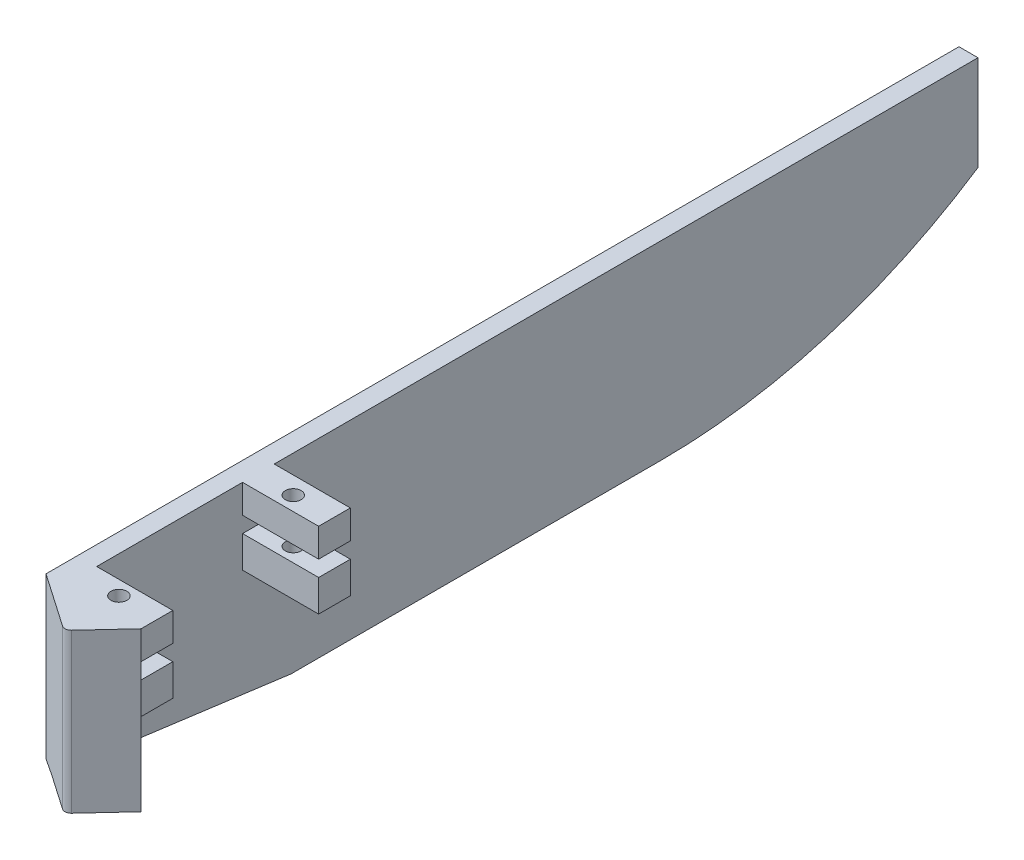
ISO-10303-21;
HEADER;
FILE_DESCRIPTION(('STEP AP214'),'2;1');
FILE_NAME('part.step','',(''),(''),'','','');
FILE_SCHEMA(('AUTOMOTIVE_DESIGN { 1 0 10303 214 1 1 1 1 }'));
ENDSEC;
DATA;
#1=APPLICATION_CONTEXT('core data for automotive mechanical design processes');
#2=APPLICATION_PROTOCOL_DEFINITION('international standard','automotive_design',2000,#1);
#3=PRODUCT_CONTEXT('',#1,'mechanical');
#4=PRODUCT('Part','Part','',(#3));
#5=PRODUCT_RELATED_PRODUCT_CATEGORY('part','',(#4));
#6=PRODUCT_DEFINITION_FORMATION('','',#4);
#7=PRODUCT_DEFINITION_CONTEXT('part definition',#1,'design');
#8=PRODUCT_DEFINITION('design','',#6,#7);
#9=PRODUCT_DEFINITION_SHAPE('','',#8);
#10=(LENGTH_UNIT() NAMED_UNIT(*) SI_UNIT(.MILLI.,.METRE.));
#11=(NAMED_UNIT(*) PLANE_ANGLE_UNIT() SI_UNIT($,.RADIAN.));
#12=(NAMED_UNIT(*) SI_UNIT($,.STERADIAN.) SOLID_ANGLE_UNIT());
#13=UNCERTAINTY_MEASURE_WITH_UNIT(LENGTH_MEASURE(1.E-05),#10,'distance_accuracy_value','');
#14=(GEOMETRIC_REPRESENTATION_CONTEXT(3) GLOBAL_UNCERTAINTY_ASSIGNED_CONTEXT((#13)) GLOBAL_UNIT_ASSIGNED_CONTEXT((#10,
#11,#12)) REPRESENTATION_CONTEXT('',''));
#15=CARTESIAN_POINT('',(0.,0.,0.));
#16=DIRECTION('',(0.,0.,1.));
#17=DIRECTION('',(1.,0.,0.));
#18=AXIS2_PLACEMENT_3D('',#15,#16,#17);
#19=CARTESIAN_POINT('',(3.,0.,0.));
#20=DIRECTION('',(0.,1.,0.));
#21=DIRECTION('',(0.,0.,1.));
#22=AXIS2_PLACEMENT_3D('',#19,#20,#21);
#23=PLANE('',#22);
#24=DIRECTION('',(1.,0.,0.));
#25=VECTOR('',#24,1.);
#26=CARTESIAN_POINT('',(-11.,0.,-100.));
#27=LINE('',#26,#25);
#28=CARTESIAN_POINT('',(0.,0.,-100.));
#29=VERTEX_POINT('',#28);
#30=CARTESIAN_POINT('',(3.,0.,-100.));
#31=VERTEX_POINT('',#30);
#32=EDGE_CURVE('E199',#29,#31,#27,.T.);
#33=ORIENTED_EDGE('',*,*,#32,.T.);
#34=DIRECTION('',(0.,0.,-1.));
#35=VECTOR('',#34,1.);
#36=CARTESIAN_POINT('',(3.,0.,0.));
#37=LINE('',#36,#35);
#38=CARTESIAN_POINT('',(3.,0.,-41.6596314448645));
#39=VERTEX_POINT('',#38);
#40=EDGE_CURVE('E208',#39,#31,#37,.T.);
#41=ORIENTED_EDGE('',*,*,#40,.F.);
#42=DIRECTION('',(1.,0.,0.));
#43=VECTOR('',#42,1.);
#44=CARTESIAN_POINT('',(-11.,0.,-41.6596314448645));
#45=LINE('',#44,#43);
#46=CARTESIAN_POINT('',(0.,0.,-41.6596314448645));
#47=VERTEX_POINT('',#46);
#48=EDGE_CURVE('E264',#47,#39,#45,.T.);
#49=ORIENTED_EDGE('',*,*,#48,.F.);
#50=DIRECTION('',(0.,0.,-1.));
#51=VECTOR('',#50,1.);
#52=CARTESIAN_POINT('',(0.,0.,0.));
#53=LINE('',#52,#51);
#54=EDGE_CURVE('E210',#47,#29,#53,.T.);
#55=ORIENTED_EDGE('',*,*,#54,.T.);
#56=EDGE_LOOP('',(#33,#41,#49,#55));
#57=FACE_BOUND('',#56,.T.);
#58=ADVANCED_FACE('F36',(#57),#23,.F.);
#59=CARTESIAN_POINT('',(3.,30.,0.));
#60=DIRECTION('',(0.,-1.,0.));
#61=DIRECTION('',(0.,0.,-1.));
#62=AXIS2_PLACEMENT_3D('',#59,#60,#61);
#63=PLANE('',#62);
#64=CARTESIAN_POINT('',(8.75,30.,-36.25));
#65=DIRECTION('',(0.,1.,0.));
#66=DIRECTION('',(0.,0.,1.));
#67=AXIS2_PLACEMENT_3D('',#64,#65,#66);
#68=CIRCLE('',#67,1.25);
#69=CARTESIAN_POINT('',(8.75,30.,-35.));
#70=VERTEX_POINT('',#69);
#71=EDGE_CURVE('E420',#70,#70,#68,.T.);
#72=ORIENTED_EDGE('',*,*,#71,.F.);
#73=EDGE_LOOP('',(#72));
#74=FACE_BOUND('',#73,.T.);
#75=CARTESIAN_POINT('',(8.75,30.,-8.75));
#76=DIRECTION('',(0.,1.,0.));
#77=DIRECTION('',(0.,0.,1.));
#78=AXIS2_PLACEMENT_3D('',#75,#76,#77);
#79=CIRCLE('',#78,1.25);
#80=CARTESIAN_POINT('',(8.75,30.,-7.5));
#81=VERTEX_POINT('',#80);
#82=EDGE_CURVE('E417',#81,#81,#79,.T.);
#83=ORIENTED_EDGE('',*,*,#82,.F.);
#84=EDGE_LOOP('',(#83));
#85=FACE_BOUND('',#84,.T.);
#86=CARTESIAN_POINT('',(9.,30.,-1.));
#87=DIRECTION('',(0.,1.,0.));
#88=DIRECTION('',(0.,0.,1.));
#89=AXIS2_PLACEMENT_3D('',#86,#87,#88);
#90=CIRCLE('',#89,1.);
#91=CARTESIAN_POINT('',(9.73327595839466,30.,-0.320068849926411));
#92=VERTEX_POINT('',#91);
#93=CARTESIAN_POINT('',(8.43174760537926,30.,-0.177145689682673));
#94=VERTEX_POINT('',#93);
#95=EDGE_CURVE('E274',#92,#94,#90,.F.);
#96=ORIENTED_EDGE('',*,*,#95,.F.);
#97=DIRECTION('',(-0.679931150073591,0.,0.733275958394658));
#98=VECTOR('',#97,1.);
#99=CARTESIAN_POINT('',(5.0739414731185,30.,4.70481927264654));
#100=LINE('',#99,#98);
#101=CARTESIAN_POINT('',(15.,30.,-6.));
#102=VERTEX_POINT('',#101);
#103=EDGE_CURVE('E410',#102,#92,#100,.T.);
#104=ORIENTED_EDGE('',*,*,#103,.F.);
#105=DIRECTION('',(0.,0.,1.));
#106=VECTOR('',#105,1.);
#107=CARTESIAN_POINT('',(15.,30.,-6.));
#108=LINE('',#107,#106);
#109=CARTESIAN_POINT('',(15.,30.,-11.));
#110=VERTEX_POINT('',#109);
#111=EDGE_CURVE('E313',#110,#102,#108,.T.);
#112=ORIENTED_EDGE('',*,*,#111,.F.);
#113=DIRECTION('',(-1.,0.,0.));
#114=VECTOR('',#113,1.);
#115=CARTESIAN_POINT('',(15.,30.,-11.));
#116=LINE('',#115,#114);
#117=CARTESIAN_POINT('',(3.,30.,-11.));
#118=VERTEX_POINT('',#117);
#119=EDGE_CURVE('E226',#110,#118,#116,.T.);
#120=ORIENTED_EDGE('',*,*,#119,.T.);
#121=DIRECTION('',(0.,0.,1.));
#122=VECTOR('',#121,1.);
#123=CARTESIAN_POINT('',(3.,30.,0.));
#124=LINE('',#123,#122);
#125=CARTESIAN_POINT('',(3.,30.,-34.));
#126=VERTEX_POINT('',#125);
#127=EDGE_CURVE('E220',#126,#118,#124,.T.);
#128=ORIENTED_EDGE('',*,*,#127,.F.);
#129=DIRECTION('',(-1.,0.,0.));
#130=VECTOR('',#129,1.);
#131=CARTESIAN_POINT('',(15.,30.,-34.));
#132=LINE('',#131,#130);
#133=CARTESIAN_POINT('',(15.,30.,-34.));
#134=VERTEX_POINT('',#133);
#135=EDGE_CURVE('E300',#134,#126,#132,.T.);
#136=ORIENTED_EDGE('',*,*,#135,.F.);
#137=DIRECTION('',(0.,0.,1.));
#138=VECTOR('',#137,1.);
#139=CARTESIAN_POINT('',(15.,30.,-34.));
#140=LINE('',#139,#138);
#141=CARTESIAN_POINT('',(15.,30.,-39.));
#142=VERTEX_POINT('',#141);
#143=EDGE_CURVE('E299',#142,#134,#140,.T.);
#144=ORIENTED_EDGE('',*,*,#143,.F.);
#145=DIRECTION('',(-1.,0.,0.));
#146=VECTOR('',#145,1.);
#147=CARTESIAN_POINT('',(15.,30.,-39.));
#148=LINE('',#147,#146);
#149=CARTESIAN_POINT('',(3.,30.,-39.));
#150=VERTEX_POINT('',#149);
#151=EDGE_CURVE('E291',#142,#150,#148,.T.);
#152=ORIENTED_EDGE('',*,*,#151,.T.);
#153=CARTESIAN_POINT('',(3.,30.,-150.));
#154=VERTEX_POINT('',#153);
#155=EDGE_CURVE('E229',#154,#150,#124,.T.);
#156=ORIENTED_EDGE('',*,*,#155,.F.);
#157=DIRECTION('',(-1.,0.,0.));
#158=VECTOR('',#157,1.);
#159=CARTESIAN_POINT('',(3.,30.,-150.));
#160=LINE('',#159,#158);
#161=CARTESIAN_POINT('',(0.,30.,-150.));
#162=VERTEX_POINT('',#161);
#163=EDGE_CURVE('E231',#154,#162,#160,.T.);
#164=ORIENTED_EDGE('',*,*,#163,.T.);
#165=DIRECTION('',(0.,0.,1.));
#166=VECTOR('',#165,1.);
#167=CARTESIAN_POINT('',(0.,30.,0.));
#168=LINE('',#167,#166);
#169=CARTESIAN_POINT('',(0.,30.,-6.));
#170=VERTEX_POINT('',#169);
#171=EDGE_CURVE('E218',#162,#170,#168,.T.);
#172=ORIENTED_EDGE('',*,*,#171,.T.);
#173=DIRECTION('',(0.822854310317324,0.,0.568252394620736));
#174=VECTOR('',#173,1.);
#175=CARTESIAN_POINT('',(2.80553359357088,30.,-4.0625352960468));
#176=LINE('',#175,#174);
#177=EDGE_CURVE('E268',#170,#94,#176,.T.);
#178=ORIENTED_EDGE('',*,*,#177,.T.);
#179=EDGE_LOOP('',(#96,#104,#112,#120,#128,#136,#144,#152,#156,#164,#172,#178));
#180=FACE_BOUND('',#179,.T.);
#181=ADVANCED_FACE('F276',(#74,#85,#180),#63,.F.);
#182=CARTESIAN_POINT('',(0.,0.,0.));
#183=DIRECTION('',(-1.,0.,0.));
#184=DIRECTION('',(0.,0.,1.));
#185=AXIS2_PLACEMENT_3D('',#182,#183,#184);
#186=PLANE('',#185);
#187=CARTESIAN_POINT('',(0.,90.8333333333334,-100.));
#188=DIRECTION('',(-1.,0.,0.));
#189=DIRECTION('',(0.,0.,1.));
#190=AXIS2_PLACEMENT_3D('',#187,#188,#189);
#191=CIRCLE('',#190,90.8333333333334);
#192=CARTESIAN_POINT('',(0.,15.,-150.));
#193=VERTEX_POINT('',#192);
#194=EDGE_CURVE('E50',#29,#193,#191,.F.);
#195=ORIENTED_EDGE('',*,*,#194,.F.);
#196=ORIENTED_EDGE('',*,*,#54,.F.);
#197=DIRECTION('',(0.,-0.131367240534839,-0.991333772305908));
#198=VECTOR('',#197,1.);
#199=CARTESIAN_POINT('',(0.,5.42528306650027,-0.718934919274195));
#200=LINE('',#199,#198);
#201=CARTESIAN_POINT('',(0.,4.72545928754627,-6.));
#202=VERTEX_POINT('',#201);
#203=EDGE_CURVE('E254',#202,#47,#200,.T.);
#204=ORIENTED_EDGE('',*,*,#203,.F.);
#205=DIRECTION('',(0.,1.,0.));
#206=VECTOR('',#205,1.);
#207=CARTESIAN_POINT('',(0.,0.,-6.));
#208=LINE('',#207,#206);
#209=EDGE_CURVE('E236',#202,#170,#208,.T.);
#210=ORIENTED_EDGE('',*,*,#209,.T.);
#211=ORIENTED_EDGE('',*,*,#171,.F.);
#212=DIRECTION('',(0.,1.,0.));
#213=VECTOR('',#212,1.);
#214=CARTESIAN_POINT('',(0.,0.,-150.));
#215=LINE('',#214,#213);
#216=EDGE_CURVE('E223',#193,#162,#215,.T.);
#217=ORIENTED_EDGE('',*,*,#216,.F.);
#218=EDGE_LOOP('',(#195,#196,#204,#210,#211,#217));
#219=FACE_BOUND('',#218,.T.);
#220=ADVANCED_FACE('F260',(#219),#186,.T.);
#221=CARTESIAN_POINT('',(3.,0.,0.));
#222=DIRECTION('',(-1.,0.,0.));
#223=DIRECTION('',(0.,0.,1.));
#224=AXIS2_PLACEMENT_3D('',#221,#222,#223);
#225=PLANE('',#224);
#226=ORIENTED_EDGE('',*,*,#40,.T.);
#227=CARTESIAN_POINT('',(3.,90.8333333333334,-100.));
#228=DIRECTION('',(-1.,0.,0.));
#229=DIRECTION('',(0.,0.,1.));
#230=AXIS2_PLACEMENT_3D('',#227,#228,#229);
#231=CIRCLE('',#230,90.8333333333334);
#232=CARTESIAN_POINT('',(3.,15.,-150.));
#233=VERTEX_POINT('',#232);
#234=EDGE_CURVE('E196',#233,#31,#231,.T.);
#235=ORIENTED_EDGE('',*,*,#234,.F.);
#236=DIRECTION('',(0.,1.,0.));
#237=VECTOR('',#236,1.);
#238=CARTESIAN_POINT('',(3.,0.,-150.));
#239=LINE('',#238,#237);
#240=EDGE_CURVE('E217',#233,#154,#239,.T.);
#241=ORIENTED_EDGE('',*,*,#240,.T.);
#242=ORIENTED_EDGE('',*,*,#155,.T.);
#243=DIRECTION('',(0.,1.,0.));
#244=VECTOR('',#243,1.);
#245=CARTESIAN_POINT('',(3.,30.,-39.));
#246=LINE('',#245,#244);
#247=CARTESIAN_POINT('',(3.,25.5,-39.));
#248=VERTEX_POINT('',#247);
#249=EDGE_CURVE('E283',#248,#150,#246,.T.);
#250=ORIENTED_EDGE('',*,*,#249,.F.);
#251=DIRECTION('',(0.,0.,-1.));
#252=VECTOR('',#251,1.);
#253=CARTESIAN_POINT('',(3.,25.5,-34.));
#254=LINE('',#253,#252);
#255=CARTESIAN_POINT('',(3.,25.5,-34.));
#256=VERTEX_POINT('',#255);
#257=EDGE_CURVE('E296',#256,#248,#254,.T.);
#258=ORIENTED_EDGE('',*,*,#257,.F.);
#259=DIRECTION('',(0.,-1.,0.));
#260=VECTOR('',#259,1.);
#261=CARTESIAN_POINT('',(3.,30.,-34.));
#262=LINE('',#261,#260);
#263=EDGE_CURVE('E465',#126,#256,#262,.T.);
#264=ORIENTED_EDGE('',*,*,#263,.F.);
#265=ORIENTED_EDGE('',*,*,#127,.T.);
#266=DIRECTION('',(0.,1.,0.));
#267=VECTOR('',#266,1.);
#268=CARTESIAN_POINT('',(3.,30.,-11.));
#269=LINE('',#268,#267);
#270=CARTESIAN_POINT('',(3.,25.500001474005,-11.));
#271=VERTEX_POINT('',#270);
#272=EDGE_CURVE('E309',#271,#118,#269,.T.);
#273=ORIENTED_EDGE('',*,*,#272,.F.);
#274=DIRECTION('',(0.,0.,-1.));
#275=VECTOR('',#274,1.);
#276=CARTESIAN_POINT('',(3.,25.500001474005,-6.00364225789055));
#277=LINE('',#276,#275);
#278=CARTESIAN_POINT('',(3.,25.500001474005,-6.00364225789055));
#279=VERTEX_POINT('',#278);
#280=EDGE_CURVE('E314',#279,#271,#277,.T.);
#281=ORIENTED_EDGE('',*,*,#280,.F.);
#282=DIRECTION('',(0.,1.,0.));
#283=VECTOR('',#282,1.);
#284=CARTESIAN_POINT('',(3.,25.500001474005,-6.00364225789055));
#285=LINE('',#284,#283);
#286=CARTESIAN_POINT('',(3.,23.000001474005,-6.00364225789055));
#287=VERTEX_POINT('',#286);
#288=EDGE_CURVE('E343',#287,#279,#285,.T.);
#289=ORIENTED_EDGE('',*,*,#288,.F.);
#290=DIRECTION('',(0.,0.,1.));
#291=VECTOR('',#290,1.);
#292=CARTESIAN_POINT('',(3.,23.000001474005,-6.00364225789055));
#293=LINE('',#292,#291);
#294=CARTESIAN_POINT('',(3.,23.000001474005,-11.0036422578905));
#295=VERTEX_POINT('',#294);
#296=EDGE_CURVE('E340',#295,#287,#293,.T.);
#297=ORIENTED_EDGE('',*,*,#296,.F.);
#298=DIRECTION('',(0.,1.,0.));
#299=VECTOR('',#298,1.);
#300=CARTESIAN_POINT('',(3.,23.000001474005,-11.0036422578905));
#301=LINE('',#300,#299);
#302=CARTESIAN_POINT('',(3.,18.000001474005,-11.0036422578906));
#303=VERTEX_POINT('',#302);
#304=EDGE_CURVE('E337',#303,#295,#301,.T.);
#305=ORIENTED_EDGE('',*,*,#304,.F.);
#306=DIRECTION('',(0.,0.,-1.));
#307=VECTOR('',#306,1.);
#308=CARTESIAN_POINT('',(3.,18.000001474005,-6.00364225789055));
#309=LINE('',#308,#307);
#310=CARTESIAN_POINT('',(3.,18.000001474005,-6.00364225789055));
#311=VERTEX_POINT('',#310);
#312=EDGE_CURVE('E334',#311,#303,#309,.T.);
#313=ORIENTED_EDGE('',*,*,#312,.F.);
#314=DIRECTION('',(0.,1.,0.));
#315=VECTOR('',#314,1.);
#316=CARTESIAN_POINT('',(3.,18.000001474005,-6.00364225789055));
#317=LINE('',#316,#315);
#318=CARTESIAN_POINT('',(3.,5.,-6.00364225789055));
#319=VERTEX_POINT('',#318);
#320=EDGE_CURVE('E332',#319,#311,#317,.T.);
#321=ORIENTED_EDGE('',*,*,#320,.F.);
#322=DIRECTION('',(0.,0.,-1.));
#323=VECTOR('',#322,1.);
#324=CARTESIAN_POINT('',(3.,5.,7.99635774210946));
#325=LINE('',#324,#323);
#326=CARTESIAN_POINT('',(3.,5.,-3.92823934627651));
#327=VERTEX_POINT('',#326);
#328=EDGE_CURVE('E400',#327,#319,#325,.T.);
#329=ORIENTED_EDGE('',*,*,#328,.F.);
#330=DIRECTION('',(0.,0.131367240534839,0.991333772305908));
#331=VECTOR('',#330,1.);
#332=CARTESIAN_POINT('',(3.,5.,-3.92823934627651));
#333=LINE('',#332,#331);
#334=EDGE_CURVE('E216',#39,#327,#333,.T.);
#335=ORIENTED_EDGE('',*,*,#334,.F.);
#336=EDGE_LOOP('',(#226,#235,#241,#242,#250,#258,#264,#265,#273,#281,#289,#297,#305,#313,#321,
#329,#335));
#337=FACE_BOUND('',#336,.T.);
#338=DIRECTION('',(0.,-1.,0.));
#339=VECTOR('',#338,1.);
#340=CARTESIAN_POINT('',(3.,23.000001474005,-34.0036422578905));
#341=LINE('',#340,#339);
#342=CARTESIAN_POINT('',(3.,23.000001474005,-34.0036422578905));
#343=VERTEX_POINT('',#342);
#344=CARTESIAN_POINT('',(3.,18.000001474005,-34.0036422578905));
#345=VERTEX_POINT('',#344);
#346=EDGE_CURVE('E432',#343,#345,#341,.T.);
#347=ORIENTED_EDGE('',*,*,#346,.F.);
#348=DIRECTION('',(0.,0.,1.));
#349=VECTOR('',#348,1.);
#350=CARTESIAN_POINT('',(3.,23.000001474005,-34.0036422578905));
#351=LINE('',#350,#349);
#352=CARTESIAN_POINT('',(3.,23.000001474005,-39.0036422578905));
#353=VERTEX_POINT('',#352);
#354=EDGE_CURVE('E437',#353,#343,#351,.T.);
#355=ORIENTED_EDGE('',*,*,#354,.F.);
#356=DIRECTION('',(0.,1.,0.));
#357=VECTOR('',#356,1.);
#358=CARTESIAN_POINT('',(3.,23.000001474005,-39.0036422578905));
#359=LINE('',#358,#357);
#360=CARTESIAN_POINT('',(3.,18.000001474005,-39.0036422578905));
#361=VERTEX_POINT('',#360);
#362=EDGE_CURVE('E449',#361,#353,#359,.T.);
#363=ORIENTED_EDGE('',*,*,#362,.F.);
#364=DIRECTION('',(0.,0.,-1.));
#365=VECTOR('',#364,1.);
#366=CARTESIAN_POINT('',(3.,18.000001474005,-34.0036422578905));
#367=LINE('',#366,#365);
#368=EDGE_CURVE('E446',#345,#361,#367,.T.);
#369=ORIENTED_EDGE('',*,*,#368,.F.);
#370=EDGE_LOOP('',(#347,#355,#363,#369));
#371=FACE_BOUND('',#370,.T.);
#372=ADVANCED_FACE('F213',(#337,#371),#225,.F.);
#373=CARTESIAN_POINT('',(3.,0.,-150.));
#374=DIRECTION('',(0.,0.,1.));
#375=DIRECTION('',(1.,0.,0.));
#376=AXIS2_PLACEMENT_3D('',#373,#374,#375);
#377=PLANE('',#376);
#378=ORIENTED_EDGE('',*,*,#240,.F.);
#379=DIRECTION('',(1.,0.,0.));
#380=VECTOR('',#379,1.);
#381=CARTESIAN_POINT('',(-11.,15.,-150.));
#382=LINE('',#381,#380);
#383=EDGE_CURVE('E12',#233,#193,#382,.F.);
#384=ORIENTED_EDGE('',*,*,#383,.T.);
#385=ORIENTED_EDGE('',*,*,#216,.T.);
#386=ORIENTED_EDGE('',*,*,#163,.F.);
#387=EDGE_LOOP('',(#378,#384,#385,#386));
#388=FACE_BOUND('',#387,.T.);
#389=ADVANCED_FACE('F281',(#388),#377,.F.);
#390=CARTESIAN_POINT('',(15.,30.,-11.));
#391=DIRECTION('',(0.,0.,1.));
#392=DIRECTION('',(1.,0.,0.));
#393=AXIS2_PLACEMENT_3D('',#390,#391,#392);
#394=PLANE('',#393);
#395=ORIENTED_EDGE('',*,*,#272,.T.);
#396=ORIENTED_EDGE('',*,*,#119,.F.);
#397=DIRECTION('',(0.,1.,0.));
#398=VECTOR('',#397,1.);
#399=CARTESIAN_POINT('',(15.,30.,-11.));
#400=LINE('',#399,#398);
#401=CARTESIAN_POINT('',(15.,25.500001474005,-11.));
#402=VERTEX_POINT('',#401);
#403=EDGE_CURVE('E310',#402,#110,#400,.T.);
#404=ORIENTED_EDGE('',*,*,#403,.F.);
#405=DIRECTION('',(-1.,0.,0.));
#406=VECTOR('',#405,1.);
#407=CARTESIAN_POINT('',(15.,25.500001474005,-11.));
#408=LINE('',#407,#406);
#409=EDGE_CURVE('E329',#402,#271,#408,.T.);
#410=ORIENTED_EDGE('',*,*,#409,.T.);
#411=EDGE_LOOP('',(#395,#396,#404,#410));
#412=FACE_BOUND('',#411,.T.);
#413=ADVANCED_FACE('F372',(#412),#394,.F.);
#414=CARTESIAN_POINT('',(15.,18.000001474005,-6.00364225789055));
#415=DIRECTION('',(0.,0.,1.));
#416=DIRECTION('',(1.,0.,0.));
#417=AXIS2_PLACEMENT_3D('',#414,#415,#416);
#418=PLANE('',#417);
#419=DIRECTION('',(0.,1.,0.));
#420=VECTOR('',#419,1.);
#421=CARTESIAN_POINT('',(15.,18.000001474005,-6.00364225789055));
#422=LINE('',#421,#420);
#423=CARTESIAN_POINT('',(15.,5.,-6.00364225789055));
#424=VERTEX_POINT('',#423);
#425=CARTESIAN_POINT('',(15.,18.000001474005,-6.00364225789055));
#426=VERTEX_POINT('',#425);
#427=EDGE_CURVE('E317',#424,#426,#422,.T.);
#428=ORIENTED_EDGE('',*,*,#427,.F.);
#429=DIRECTION('',(1.,0.,0.));
#430=VECTOR('',#429,1.);
#431=CARTESIAN_POINT('',(15.,5.,-6.00364225789055));
#432=LINE('',#431,#430);
#433=EDGE_CURVE('E263',#319,#424,#432,.T.);
#434=ORIENTED_EDGE('',*,*,#433,.F.);
#435=ORIENTED_EDGE('',*,*,#320,.T.);
#436=DIRECTION('',(-1.,0.,0.));
#437=VECTOR('',#436,1.);
#438=CARTESIAN_POINT('',(15.,18.000001474005,-6.00364225789055));
#439=LINE('',#438,#437);
#440=EDGE_CURVE('E361',#426,#311,#439,.T.);
#441=ORIENTED_EDGE('',*,*,#440,.F.);
#442=EDGE_LOOP('',(#428,#434,#435,#441));
#443=FACE_BOUND('',#442,.T.);
#444=ADVANCED_FACE('F399',(#443),#418,.F.);
#445=CARTESIAN_POINT('',(15.,18.000001474005,-6.00364225789055));
#446=DIRECTION('',(0.,1.,0.));
#447=DIRECTION('',(0.,0.,1.));
#448=AXIS2_PLACEMENT_3D('',#445,#446,#447);
#449=PLANE('',#448);
#450=CARTESIAN_POINT('',(8.75,18.,-8.75));
#451=DIRECTION('',(0.,1.,0.));
#452=DIRECTION('',(0.,0.,1.));
#453=AXIS2_PLACEMENT_3D('',#450,#451,#452);
#454=CIRCLE('',#453,1.25);
#455=CARTESIAN_POINT('',(8.75,18.,-7.5));
#456=VERTEX_POINT('',#455);
#457=EDGE_CURVE('E423',#456,#456,#454,.T.);
#458=ORIENTED_EDGE('',*,*,#457,.T.);
#459=EDGE_LOOP('',(#458));
#460=FACE_BOUND('',#459,.T.);
#461=ORIENTED_EDGE('',*,*,#312,.T.);
#462=DIRECTION('',(-1.,0.,0.));
#463=VECTOR('',#462,1.);
#464=CARTESIAN_POINT('',(15.,18.000001474005,-11.0036422578906));
#465=LINE('',#464,#463);
#466=CARTESIAN_POINT('',(15.,18.000001474005,-11.0036422578906));
#467=VERTEX_POINT('',#466);
#468=EDGE_CURVE('E359',#467,#303,#465,.T.);
#469=ORIENTED_EDGE('',*,*,#468,.F.);
#470=DIRECTION('',(0.,0.,-1.));
#471=VECTOR('',#470,1.);
#472=CARTESIAN_POINT('',(15.,18.000001474005,-6.00364225789055));
#473=LINE('',#472,#471);
#474=EDGE_CURVE('E319',#426,#467,#473,.T.);
#475=ORIENTED_EDGE('',*,*,#474,.F.);
#476=ORIENTED_EDGE('',*,*,#440,.T.);
#477=EDGE_LOOP('',(#461,#469,#475,#476));
#478=FACE_BOUND('',#477,.T.);
#479=ADVANCED_FACE('F392',(#460,#478),#449,.F.);
#480=CARTESIAN_POINT('',(15.,23.000001474005,-11.0036422578905));
#481=DIRECTION('',(0.,0.,1.));
#482=DIRECTION('',(0.,-1.,0.));
#483=AXIS2_PLACEMENT_3D('',#480,#481,#482);
#484=PLANE('',#483);
#485=ORIENTED_EDGE('',*,*,#304,.T.);
#486=DIRECTION('',(-1.,0.,0.));
#487=VECTOR('',#486,1.);
#488=CARTESIAN_POINT('',(15.,23.000001474005,-11.0036422578905));
#489=LINE('',#488,#487);
#490=CARTESIAN_POINT('',(15.,23.000001474005,-11.0036422578905));
#491=VERTEX_POINT('',#490);
#492=EDGE_CURVE('E356',#491,#295,#489,.T.);
#493=ORIENTED_EDGE('',*,*,#492,.F.);
#494=DIRECTION('',(0.,1.,0.));
#495=VECTOR('',#494,1.);
#496=CARTESIAN_POINT('',(15.,23.000001474005,-11.0036422578905));
#497=LINE('',#496,#495);
#498=EDGE_CURVE('E321',#467,#491,#497,.T.);
#499=ORIENTED_EDGE('',*,*,#498,.F.);
#500=ORIENTED_EDGE('',*,*,#468,.T.);
#501=EDGE_LOOP('',(#485,#493,#499,#500));
#502=FACE_BOUND('',#501,.T.);
#503=ADVANCED_FACE('F388',(#502),#484,.F.);
#504=CARTESIAN_POINT('',(15.,23.000001474005,-6.00364225789055));
#505=DIRECTION('',(0.,-1.,0.));
#506=DIRECTION('',(0.,0.,-1.));
#507=AXIS2_PLACEMENT_3D('',#504,#505,#506);
#508=PLANE('',#507);
#509=CARTESIAN_POINT('',(8.75,23.000001474005,-8.75));
#510=DIRECTION('',(0.,-1.,0.));
#511=DIRECTION('',(0.,0.,-1.));
#512=AXIS2_PLACEMENT_3D('',#509,#510,#511);
#513=CIRCLE('',#512,1.25);
#514=CARTESIAN_POINT('',(8.75,23.000001474005,-10.));
#515=VERTEX_POINT('',#514);
#516=EDGE_CURVE('E245',#515,#515,#513,.T.);
#517=ORIENTED_EDGE('',*,*,#516,.T.);
#518=EDGE_LOOP('',(#517));
#519=FACE_BOUND('',#518,.T.);
#520=ORIENTED_EDGE('',*,*,#296,.T.);
#521=DIRECTION('',(-1.,0.,0.));
#522=VECTOR('',#521,1.);
#523=CARTESIAN_POINT('',(15.,23.000001474005,-6.00364225789055));
#524=LINE('',#523,#522);
#525=CARTESIAN_POINT('',(15.,23.000001474005,-6.00364225789055));
#526=VERTEX_POINT('',#525);
#527=EDGE_CURVE('E353',#526,#287,#524,.T.);
#528=ORIENTED_EDGE('',*,*,#527,.F.);
#529=DIRECTION('',(0.,0.,1.));
#530=VECTOR('',#529,1.);
#531=CARTESIAN_POINT('',(15.,23.000001474005,-6.00364225789055));
#532=LINE('',#531,#530);
#533=EDGE_CURVE('E323',#491,#526,#532,.T.);
#534=ORIENTED_EDGE('',*,*,#533,.F.);
#535=ORIENTED_EDGE('',*,*,#492,.T.);
#536=EDGE_LOOP('',(#520,#528,#534,#535));
#537=FACE_BOUND('',#536,.T.);
#538=ADVANCED_FACE('F383',(#519,#537),#508,.F.);
#539=CARTESIAN_POINT('',(15.,25.500001474005,-6.00364225789055));
#540=DIRECTION('',(0.,0.,1.));
#541=DIRECTION('',(0.,-1.,0.));
#542=AXIS2_PLACEMENT_3D('',#539,#540,#541);
#543=PLANE('',#542);
#544=ORIENTED_EDGE('',*,*,#288,.T.);
#545=DIRECTION('',(-1.,0.,0.));
#546=VECTOR('',#545,1.);
#547=CARTESIAN_POINT('',(15.,25.500001474005,-6.00364225789055));
#548=LINE('',#547,#546);
#549=CARTESIAN_POINT('',(15.,25.500001474005,-6.00364225789055));
#550=VERTEX_POINT('',#549);
#551=EDGE_CURVE('E350',#550,#279,#548,.T.);
#552=ORIENTED_EDGE('',*,*,#551,.F.);
#553=DIRECTION('',(0.,1.,0.));
#554=VECTOR('',#553,1.);
#555=CARTESIAN_POINT('',(15.,25.500001474005,-6.00364225789055));
#556=LINE('',#555,#554);
#557=EDGE_CURVE('E325',#526,#550,#556,.T.);
#558=ORIENTED_EDGE('',*,*,#557,.F.);
#559=ORIENTED_EDGE('',*,*,#527,.T.);
#560=EDGE_LOOP('',(#544,#552,#558,#559));
#561=FACE_BOUND('',#560,.T.);
#562=ADVANCED_FACE('F380',(#561),#543,.F.);
#563=CARTESIAN_POINT('',(15.,25.500001474005,-6.00364225789055));
#564=DIRECTION('',(0.,1.,0.));
#565=DIRECTION('',(0.,0.,1.));
#566=AXIS2_PLACEMENT_3D('',#563,#564,#565);
#567=PLANE('',#566);
#568=CARTESIAN_POINT('',(8.75,25.500001474005,-8.75));
#569=DIRECTION('',(0.,1.,0.));
#570=DIRECTION('',(0.,0.,1.));
#571=AXIS2_PLACEMENT_3D('',#568,#569,#570);
#572=CIRCLE('',#571,1.25);
#573=CARTESIAN_POINT('',(8.75,25.500001474005,-7.5));
#574=VERTEX_POINT('',#573);
#575=EDGE_CURVE('E242',#574,#574,#572,.T.);
#576=ORIENTED_EDGE('',*,*,#575,.T.);
#577=EDGE_LOOP('',(#576));
#578=FACE_BOUND('',#577,.T.);
#579=ORIENTED_EDGE('',*,*,#280,.T.);
#580=ORIENTED_EDGE('',*,*,#409,.F.);
#581=DIRECTION('',(0.,0.,-1.));
#582=VECTOR('',#581,1.);
#583=CARTESIAN_POINT('',(15.,25.500001474005,-6.00364225789055));
#584=LINE('',#583,#582);
#585=EDGE_CURVE('E327',#550,#402,#584,.T.);
#586=ORIENTED_EDGE('',*,*,#585,.F.);
#587=ORIENTED_EDGE('',*,*,#551,.T.);
#588=EDGE_LOOP('',(#579,#580,#586,#587));
#589=FACE_BOUND('',#588,.T.);
#590=ADVANCED_FACE('F375',(#578,#589),#567,.F.);
#591=CARTESIAN_POINT('',(15.,0.,0.));
#592=DIRECTION('',(1.,0.,0.));
#593=DIRECTION('',(0.,0.,-1.));
#594=AXIS2_PLACEMENT_3D('',#591,#592,#593);
#595=PLANE('',#594);
#596=DIRECTION('',(0.,0.,-1.));
#597=VECTOR('',#596,1.);
#598=CARTESIAN_POINT('',(15.,5.,7.99635774210946));
#599=LINE('',#598,#597);
#600=CARTESIAN_POINT('',(15.,5.,-6.));
#601=VERTEX_POINT('',#600);
#602=EDGE_CURVE('E57',#601,#424,#599,.T.);
#603=ORIENTED_EDGE('',*,*,#602,.T.);
#604=ORIENTED_EDGE('',*,*,#427,.T.);
#605=ORIENTED_EDGE('',*,*,#474,.T.);
#606=ORIENTED_EDGE('',*,*,#498,.T.);
#607=ORIENTED_EDGE('',*,*,#533,.T.);
#608=ORIENTED_EDGE('',*,*,#557,.T.);
#609=ORIENTED_EDGE('',*,*,#585,.T.);
#610=ORIENTED_EDGE('',*,*,#403,.T.);
#611=ORIENTED_EDGE('',*,*,#111,.T.);
#612=DIRECTION('',(0.,1.,0.));
#613=VECTOR('',#612,1.);
#614=CARTESIAN_POINT('',(15.,0.,-6.));
#615=LINE('',#614,#613);
#616=EDGE_CURVE('E247',#601,#102,#615,.T.);
#617=ORIENTED_EDGE('',*,*,#616,.F.);
#618=EDGE_LOOP('',(#603,#604,#605,#606,#607,#608,#609,#610,#611,#617));
#619=FACE_BOUND('',#618,.T.);
#620=ADVANCED_FACE('F394',(#619),#595,.T.);
#621=CARTESIAN_POINT('',(15.,30.,-34.));
#622=DIRECTION('',(0.,0.,-1.));
#623=DIRECTION('',(0.,1.,0.));
#624=AXIS2_PLACEMENT_3D('',#621,#622,#623);
#625=PLANE('',#624);
#626=ORIENTED_EDGE('',*,*,#263,.T.);
#627=DIRECTION('',(-1.,0.,0.));
#628=VECTOR('',#627,1.);
#629=CARTESIAN_POINT('',(15.,25.5,-34.));
#630=LINE('',#629,#628);
#631=CARTESIAN_POINT('',(15.,25.5,-34.));
#632=VERTEX_POINT('',#631);
#633=EDGE_CURVE('E302',#632,#256,#630,.T.);
#634=ORIENTED_EDGE('',*,*,#633,.F.);
#635=DIRECTION('',(0.,-1.,0.));
#636=VECTOR('',#635,1.);
#637=CARTESIAN_POINT('',(15.,30.,-34.));
#638=LINE('',#637,#636);
#639=EDGE_CURVE('E295',#134,#632,#638,.T.);
#640=ORIENTED_EDGE('',*,*,#639,.F.);
#641=ORIENTED_EDGE('',*,*,#135,.T.);
#642=EDGE_LOOP('',(#626,#634,#640,#641));
#643=FACE_BOUND('',#642,.T.);
#644=ADVANCED_FACE('F480',(#643),#625,.F.);
#645=CARTESIAN_POINT('',(15.,25.5,-34.));
#646=DIRECTION('',(0.,1.,0.));
#647=DIRECTION('',(0.,0.,1.));
#648=AXIS2_PLACEMENT_3D('',#645,#646,#647);
#649=PLANE('',#648);
#650=CARTESIAN_POINT('',(8.75,25.5,-36.25));
#651=DIRECTION('',(0.,1.,0.));
#652=DIRECTION('',(0.,0.,1.));
#653=AXIS2_PLACEMENT_3D('',#650,#651,#652);
#654=CIRCLE('',#653,1.25);
#655=CARTESIAN_POINT('',(8.75,25.5,-35.));
#656=VERTEX_POINT('',#655);
#657=EDGE_CURVE('E240',#656,#656,#654,.T.);
#658=ORIENTED_EDGE('',*,*,#657,.T.);
#659=EDGE_LOOP('',(#658));
#660=FACE_BOUND('',#659,.T.);
#661=ORIENTED_EDGE('',*,*,#257,.T.);
#662=DIRECTION('',(-1.,0.,0.));
#663=VECTOR('',#662,1.);
#664=CARTESIAN_POINT('',(15.,25.5,-39.));
#665=LINE('',#664,#663);
#666=CARTESIAN_POINT('',(15.,25.5,-39.));
#667=VERTEX_POINT('',#666);
#668=EDGE_CURVE('E294',#667,#248,#665,.T.);
#669=ORIENTED_EDGE('',*,*,#668,.F.);
#670=DIRECTION('',(0.,0.,-1.));
#671=VECTOR('',#670,1.);
#672=CARTESIAN_POINT('',(15.,25.5,-34.));
#673=LINE('',#672,#671);
#674=EDGE_CURVE('E468',#632,#667,#673,.T.);
#675=ORIENTED_EDGE('',*,*,#674,.F.);
#676=ORIENTED_EDGE('',*,*,#633,.T.);
#677=EDGE_LOOP('',(#661,#669,#675,#676));
#678=FACE_BOUND('',#677,.T.);
#679=ADVANCED_FACE('F476',(#660,#678),#649,.F.);
#680=CARTESIAN_POINT('',(15.,30.,-39.));
#681=DIRECTION('',(0.,0.,1.));
#682=DIRECTION('',(0.,-1.,0.));
#683=AXIS2_PLACEMENT_3D('',#680,#681,#682);
#684=PLANE('',#683);
#685=ORIENTED_EDGE('',*,*,#249,.T.);
#686=ORIENTED_EDGE('',*,*,#151,.F.);
#687=DIRECTION('',(0.,1.,0.));
#688=VECTOR('',#687,1.);
#689=CARTESIAN_POINT('',(15.,30.,-39.));
#690=LINE('',#689,#688);
#691=EDGE_CURVE('E470',#667,#142,#690,.T.);
#692=ORIENTED_EDGE('',*,*,#691,.F.);
#693=ORIENTED_EDGE('',*,*,#668,.T.);
#694=EDGE_LOOP('',(#685,#686,#692,#693));
#695=FACE_BOUND('',#694,.T.);
#696=ADVANCED_FACE('F289',(#695),#684,.F.);
#697=CARTESIAN_POINT('',(15.,0.,0.));
#698=DIRECTION('',(1.,0.,0.));
#699=DIRECTION('',(0.,0.,-1.));
#700=AXIS2_PLACEMENT_3D('',#697,#698,#699);
#701=PLANE('',#700);
#702=ORIENTED_EDGE('',*,*,#639,.T.);
#703=ORIENTED_EDGE('',*,*,#674,.T.);
#704=ORIENTED_EDGE('',*,*,#691,.T.);
#705=ORIENTED_EDGE('',*,*,#143,.T.);
#706=EDGE_LOOP('',(#702,#703,#704,#705));
#707=FACE_BOUND('',#706,.T.);
#708=ADVANCED_FACE('F482',(#707),#701,.T.);
#709=CARTESIAN_POINT('',(15.,23.000001474005,-34.0036422578905));
#710=DIRECTION('',(0.,0.,-1.));
#711=DIRECTION('',(-1.,0.,0.));
#712=AXIS2_PLACEMENT_3D('',#709,#710,#711);
#713=PLANE('',#712);
#714=ORIENTED_EDGE('',*,*,#346,.T.);
#715=DIRECTION('',(-1.,0.,0.));
#716=VECTOR('',#715,1.);
#717=CARTESIAN_POINT('',(15.,18.000001474005,-34.0036422578905));
#718=LINE('',#717,#716);
#719=CARTESIAN_POINT('',(15.,18.000001474005,-34.0036422578905));
#720=VERTEX_POINT('',#719);
#721=EDGE_CURVE('E462',#720,#345,#718,.T.);
#722=ORIENTED_EDGE('',*,*,#721,.F.);
#723=DIRECTION('',(0.,-1.,0.));
#724=VECTOR('',#723,1.);
#725=CARTESIAN_POINT('',(15.,23.000001474005,-34.0036422578905));
#726=LINE('',#725,#724);
#727=CARTESIAN_POINT('',(15.,23.000001474005,-34.0036422578905));
#728=VERTEX_POINT('',#727);
#729=EDGE_CURVE('E433',#728,#720,#726,.T.);
#730=ORIENTED_EDGE('',*,*,#729,.F.);
#731=DIRECTION('',(-1.,0.,0.));
#732=VECTOR('',#731,1.);
#733=CARTESIAN_POINT('',(15.,23.000001474005,-34.0036422578905));
#734=LINE('',#733,#732);
#735=EDGE_CURVE('E443',#728,#343,#734,.T.);
#736=ORIENTED_EDGE('',*,*,#735,.T.);
#737=EDGE_LOOP('',(#714,#722,#730,#736));
#738=FACE_BOUND('',#737,.T.);
#739=ADVANCED_FACE('F484',(#738),#713,.F.);
#740=CARTESIAN_POINT('',(15.,18.000001474005,-34.0036422578905));
#741=DIRECTION('',(0.,1.,0.));
#742=DIRECTION('',(0.,0.,1.));
#743=AXIS2_PLACEMENT_3D('',#740,#741,#742);
#744=PLANE('',#743);
#745=CARTESIAN_POINT('',(8.75,18.,-36.25));
#746=DIRECTION('',(0.,1.,0.));
#747=DIRECTION('',(0.,0.,1.));
#748=AXIS2_PLACEMENT_3D('',#745,#746,#747);
#749=CIRCLE('',#748,1.25);
#750=CARTESIAN_POINT('',(8.75,18.,-35.));
#751=VERTEX_POINT('',#750);
#752=EDGE_CURVE('E241',#751,#751,#749,.T.);
#753=ORIENTED_EDGE('',*,*,#752,.T.);
#754=EDGE_LOOP('',(#753));
#755=FACE_BOUND('',#754,.T.);
#756=ORIENTED_EDGE('',*,*,#368,.T.);
#757=DIRECTION('',(-1.,0.,0.));
#758=VECTOR('',#757,1.);
#759=CARTESIAN_POINT('',(15.,18.000001474005,-39.0036422578905));
#760=LINE('',#759,#758);
#761=CARTESIAN_POINT('',(15.,18.000001474005,-39.0036422578905));
#762=VERTEX_POINT('',#761);
#763=EDGE_CURVE('E459',#762,#361,#760,.T.);
#764=ORIENTED_EDGE('',*,*,#763,.F.);
#765=DIRECTION('',(0.,0.,-1.));
#766=VECTOR('',#765,1.);
#767=CARTESIAN_POINT('',(15.,18.000001474005,-34.0036422578905));
#768=LINE('',#767,#766);
#769=EDGE_CURVE('E436',#720,#762,#768,.T.);
#770=ORIENTED_EDGE('',*,*,#769,.F.);
#771=ORIENTED_EDGE('',*,*,#721,.T.);
#772=EDGE_LOOP('',(#756,#764,#770,#771));
#773=FACE_BOUND('',#772,.T.);
#774=ADVANCED_FACE('F490',(#755,#773),#744,.F.);
#775=CARTESIAN_POINT('',(15.,23.000001474005,-39.0036422578905));
#776=DIRECTION('',(0.,0.,1.));
#777=DIRECTION('',(1.,0.,0.));
#778=AXIS2_PLACEMENT_3D('',#775,#776,#777);
#779=PLANE('',#778);
#780=ORIENTED_EDGE('',*,*,#362,.T.);
#781=DIRECTION('',(-1.,0.,0.));
#782=VECTOR('',#781,1.);
#783=CARTESIAN_POINT('',(15.,23.000001474005,-39.0036422578905));
#784=LINE('',#783,#782);
#785=CARTESIAN_POINT('',(15.,23.000001474005,-39.0036422578905));
#786=VERTEX_POINT('',#785);
#787=EDGE_CURVE('E456',#786,#353,#784,.T.);
#788=ORIENTED_EDGE('',*,*,#787,.F.);
#789=DIRECTION('',(0.,1.,0.));
#790=VECTOR('',#789,1.);
#791=CARTESIAN_POINT('',(15.,23.000001474005,-39.0036422578905));
#792=LINE('',#791,#790);
#793=EDGE_CURVE('E439',#762,#786,#792,.T.);
#794=ORIENTED_EDGE('',*,*,#793,.F.);
#795=ORIENTED_EDGE('',*,*,#763,.T.);
#796=EDGE_LOOP('',(#780,#788,#794,#795));
#797=FACE_BOUND('',#796,.T.);
#798=ADVANCED_FACE('F568',(#797),#779,.F.);
#799=CARTESIAN_POINT('',(15.,23.000001474005,-34.0036422578905));
#800=DIRECTION('',(0.,-1.,0.));
#801=DIRECTION('',(0.,0.,-1.));
#802=AXIS2_PLACEMENT_3D('',#799,#800,#801);
#803=PLANE('',#802);
#804=CARTESIAN_POINT('',(8.75,23.000001474005,-36.25));
#805=DIRECTION('',(0.,-1.,0.));
#806=DIRECTION('',(0.,0.,-1.));
#807=AXIS2_PLACEMENT_3D('',#804,#805,#806);
#808=CIRCLE('',#807,1.25);
#809=CARTESIAN_POINT('',(8.75,23.000001474005,-37.5));
#810=VERTEX_POINT('',#809);
#811=EDGE_CURVE('E237',#810,#810,#808,.T.);
#812=ORIENTED_EDGE('',*,*,#811,.T.);
#813=EDGE_LOOP('',(#812));
#814=FACE_BOUND('',#813,.T.);
#815=ORIENTED_EDGE('',*,*,#354,.T.);
#816=ORIENTED_EDGE('',*,*,#735,.F.);
#817=DIRECTION('',(0.,0.,1.));
#818=VECTOR('',#817,1.);
#819=CARTESIAN_POINT('',(15.,23.000001474005,-34.0036422578905));
#820=LINE('',#819,#818);
#821=EDGE_CURVE('E441',#786,#728,#820,.T.);
#822=ORIENTED_EDGE('',*,*,#821,.F.);
#823=ORIENTED_EDGE('',*,*,#787,.T.);
#824=EDGE_LOOP('',(#815,#816,#822,#823));
#825=FACE_BOUND('',#824,.T.);
#826=ADVANCED_FACE('F564',(#814,#825),#803,.F.);
#827=CARTESIAN_POINT('',(15.,0.,0.));
#828=DIRECTION('',(1.,0.,0.));
#829=DIRECTION('',(0.,0.,-1.));
#830=AXIS2_PLACEMENT_3D('',#827,#828,#829);
#831=PLANE('',#830);
#832=ORIENTED_EDGE('',*,*,#729,.T.);
#833=ORIENTED_EDGE('',*,*,#769,.T.);
#834=ORIENTED_EDGE('',*,*,#793,.T.);
#835=ORIENTED_EDGE('',*,*,#821,.T.);
#836=EDGE_LOOP('',(#832,#833,#834,#835));
#837=FACE_BOUND('',#836,.T.);
#838=ADVANCED_FACE('F554',(#837),#831,.T.);
#839=CARTESIAN_POINT('',(8.75,18.,-36.25));
#840=DIRECTION('',(0.,1.,0.));
#841=DIRECTION('',(0.,0.,1.));
#842=AXIS2_PLACEMENT_3D('',#839,#840,#841);
#843=CYLINDRICAL_SURFACE('',#842,1.25);
#844=ORIENTED_EDGE('',*,*,#752,.F.);
#845=EDGE_LOOP('',(#844));
#846=FACE_BOUND('',#845,.T.);
#847=ORIENTED_EDGE('',*,*,#811,.F.);
#848=EDGE_LOOP('',(#847));
#849=FACE_BOUND('',#848,.T.);
#850=ADVANCED_FACE('F544',(#846,#849),#843,.F.);
#851=ORIENTED_EDGE('',*,*,#71,.T.);
#852=EDGE_LOOP('',(#851));
#853=FACE_BOUND('',#852,.T.);
#854=ORIENTED_EDGE('',*,*,#657,.F.);
#855=EDGE_LOOP('',(#854));
#856=FACE_BOUND('',#855,.T.);
#857=ADVANCED_FACE('F541',(#853,#856),#843,.F.);
#858=CARTESIAN_POINT('',(8.75,18.,-8.75));
#859=DIRECTION('',(0.,1.,0.));
#860=DIRECTION('',(0.,0.,1.));
#861=AXIS2_PLACEMENT_3D('',#858,#859,#860);
#862=CYLINDRICAL_SURFACE('',#861,1.25);
#863=ORIENTED_EDGE('',*,*,#82,.T.);
#864=EDGE_LOOP('',(#863));
#865=FACE_BOUND('',#864,.T.);
#866=ORIENTED_EDGE('',*,*,#575,.F.);
#867=EDGE_LOOP('',(#866));
#868=FACE_BOUND('',#867,.T.);
#869=ADVANCED_FACE('F543',(#865,#868),#862,.F.);
#870=ORIENTED_EDGE('',*,*,#457,.F.);
#871=EDGE_LOOP('',(#870));
#872=FACE_BOUND('',#871,.T.);
#873=ORIENTED_EDGE('',*,*,#516,.F.);
#874=EDGE_LOOP('',(#873));
#875=FACE_BOUND('',#874,.T.);
#876=ADVANCED_FACE('F551',(#872,#875),#862,.F.);
#877=CARTESIAN_POINT('',(9.,-3.00000000000002,-1.));
#878=DIRECTION('',(0.,1.,0.));
#879=DIRECTION('',(0.,0.,1.));
#880=AXIS2_PLACEMENT_3D('',#877,#878,#879);
#881=CYLINDRICAL_SURFACE('',#880,1.);
#882=DIRECTION('',(0.,1.,0.));
#883=VECTOR('',#882,1.);
#884=CARTESIAN_POINT('',(8.43174760537926,-3.00000000000002,-0.177145689682673));
#885=LINE('',#884,#883);
#886=CARTESIAN_POINT('',(8.43174760537926,5.,-0.177145689682676));
#887=VERTEX_POINT('',#886);
#888=EDGE_CURVE('E270',#887,#94,#885,.T.);
#889=ORIENTED_EDGE('',*,*,#888,.F.);
#890=CARTESIAN_POINT('',(9.,5.,-1.));
#891=DIRECTION('',(0.,1.,0.));
#892=DIRECTION('',(0.,0.,1.));
#893=AXIS2_PLACEMENT_3D('',#890,#891,#892);
#894=CIRCLE('',#893,1.);
#895=CARTESIAN_POINT('',(9.73327595839466,5.,-0.320068849926412));
#896=VERTEX_POINT('',#895);
#897=EDGE_CURVE('E402',#887,#896,#894,.T.);
#898=ORIENTED_EDGE('',*,*,#897,.T.);
#899=DIRECTION('',(0.,1.,0.));
#900=VECTOR('',#899,1.);
#901=CARTESIAN_POINT('',(9.73327595839466,-3.00000000000002,-0.320068849926411));
#902=LINE('',#901,#900);
#903=EDGE_CURVE('E413',#896,#92,#902,.T.);
#904=ORIENTED_EDGE('',*,*,#903,.T.);
#905=ORIENTED_EDGE('',*,*,#95,.T.);
#906=EDGE_LOOP('',(#889,#898,#904,#905));
#907=FACE_BOUND('',#906,.T.);
#908=ADVANCED_FACE('F557',(#907),#881,.T.);
#909=CARTESIAN_POINT('',(2.80553359357088,-3.00000000000002,-4.0625352960468));
#910=DIRECTION('',(-0.568252394620736,0.,0.822854310317324));
#911=DIRECTION('',(0.822854310317324,0.,0.568252394620736));
#912=AXIS2_PLACEMENT_3D('',#909,#910,#911);
#913=PLANE('',#912);
#914=DIRECTION('',(-0.820531211655288,-0.075089741146122,-0.566648093153161));
#915=VECTOR('',#914,1.);
#916=CARTESIAN_POINT('',(2.31372227613483,4.93719627491631,-4.40217374155344));
#917=LINE('',#916,#915);
#918=EDGE_CURVE('E43',#327,#202,#917,.T.);
#919=ORIENTED_EDGE('',*,*,#918,.F.);
#920=DIRECTION('',(-0.822854310317324,0.,-0.568252394620736));
#921=VECTOR('',#920,1.);
#922=CARTESIAN_POINT('',(2.80553359357088,5.,-4.0625352960468));
#923=LINE('',#922,#921);
#924=EDGE_CURVE('E408',#887,#327,#923,.T.);
#925=ORIENTED_EDGE('',*,*,#924,.F.);
#926=ORIENTED_EDGE('',*,*,#888,.T.);
#927=ORIENTED_EDGE('',*,*,#177,.F.);
#928=ORIENTED_EDGE('',*,*,#209,.F.);
#929=EDGE_LOOP('',(#919,#925,#926,#927,#928));
#930=FACE_BOUND('',#929,.T.);
#931=ADVANCED_FACE('F266',(#930),#913,.T.);
#932=CARTESIAN_POINT('',(5.0739414731185,-3.00000000000002,4.70481927264654));
#933=DIRECTION('',(-0.733275958394658,0.,-0.679931150073591));
#934=DIRECTION('',(-0.679931150073591,0.,0.733275958394658));
#935=AXIS2_PLACEMENT_3D('',#932,#933,#934);
#936=PLANE('',#935);
#937=ORIENTED_EDGE('',*,*,#903,.F.);
#938=DIRECTION('',(0.679931150073591,0.,-0.733275958394658));
#939=VECTOR('',#938,1.);
#940=CARTESIAN_POINT('',(5.0739414731185,5.,4.70481927264654));
#941=LINE('',#940,#939);
#942=EDGE_CURVE('E249',#896,#601,#941,.T.);
#943=ORIENTED_EDGE('',*,*,#942,.T.);
#944=ORIENTED_EDGE('',*,*,#616,.T.);
#945=ORIENTED_EDGE('',*,*,#103,.T.);
#946=EDGE_LOOP('',(#937,#943,#944,#945));
#947=FACE_BOUND('',#946,.T.);
#948=ADVANCED_FACE('F662',(#947),#936,.F.);
#949=CARTESIAN_POINT('',(15.,5.,7.99635774210946));
#950=DIRECTION('',(0.,1.,0.));
#951=DIRECTION('',(0.,0.,1.));
#952=AXIS2_PLACEMENT_3D('',#949,#950,#951);
#953=PLANE('',#952);
#954=ORIENTED_EDGE('',*,*,#924,.T.);
#955=ORIENTED_EDGE('',*,*,#328,.T.);
#956=ORIENTED_EDGE('',*,*,#433,.T.);
#957=ORIENTED_EDGE('',*,*,#602,.F.);
#958=ORIENTED_EDGE('',*,*,#942,.F.);
#959=ORIENTED_EDGE('',*,*,#897,.F.);
#960=EDGE_LOOP('',(#954,#955,#956,#957,#958,#959));
#961=FACE_BOUND('',#960,.T.);
#962=ADVANCED_FACE('F667',(#961),#953,.F.);
#963=CARTESIAN_POINT('',(-11.,5.,-3.92823934627651));
#964=DIRECTION('',(0.,0.991333772305908,-0.131367240534839));
#965=DIRECTION('',(0.,0.131367240534839,0.991333772305908));
#966=AXIS2_PLACEMENT_3D('',#963,#964,#965);
#967=PLANE('',#966);
#968=ORIENTED_EDGE('',*,*,#203,.T.);
#969=ORIENTED_EDGE('',*,*,#48,.T.);
#970=ORIENTED_EDGE('',*,*,#334,.T.);
#971=ORIENTED_EDGE('',*,*,#918,.T.);
#972=EDGE_LOOP('',(#968,#969,#970,#971));
#973=FACE_BOUND('',#972,.T.);
#974=ADVANCED_FACE('F253',(#973),#967,.F.);
#975=CARTESIAN_POINT('',(-11.,90.8333333333334,-100.));
#976=DIRECTION('',(1.,0.,0.));
#977=DIRECTION('',(0.,0.,-1.));
#978=AXIS2_PLACEMENT_3D('',#975,#976,#977);
#979=CYLINDRICAL_SURFACE('',#978,90.8333333333334);
#980=ORIENTED_EDGE('',*,*,#194,.T.);
#981=ORIENTED_EDGE('',*,*,#383,.F.);
#982=ORIENTED_EDGE('',*,*,#234,.T.);
#983=ORIENTED_EDGE('',*,*,#32,.F.);
#984=EDGE_LOOP('',(#980,#981,#982,#983));
#985=FACE_BOUND('',#984,.T.);
#986=ADVANCED_FACE('F198',(#985),#979,.T.);
#987=CLOSED_SHELL('',(#58,#181,#220,#372,#389,#413,#444,#479,#503,#538,#562,#590,#620,#644,#679,
#696,#708,#739,#774,#798,#826,#838,#850,#857,#869,#876,#908,#931,#948,#962,#974,#986));
#988=MANIFOLD_SOLID_BREP('B2',#987);
#989=ADVANCED_BREP_SHAPE_REPRESENTATION('',(#18,#988),#14);
#990=SHAPE_DEFINITION_REPRESENTATION(#9,#989);
ENDSEC;
END-ISO-10303-21;
